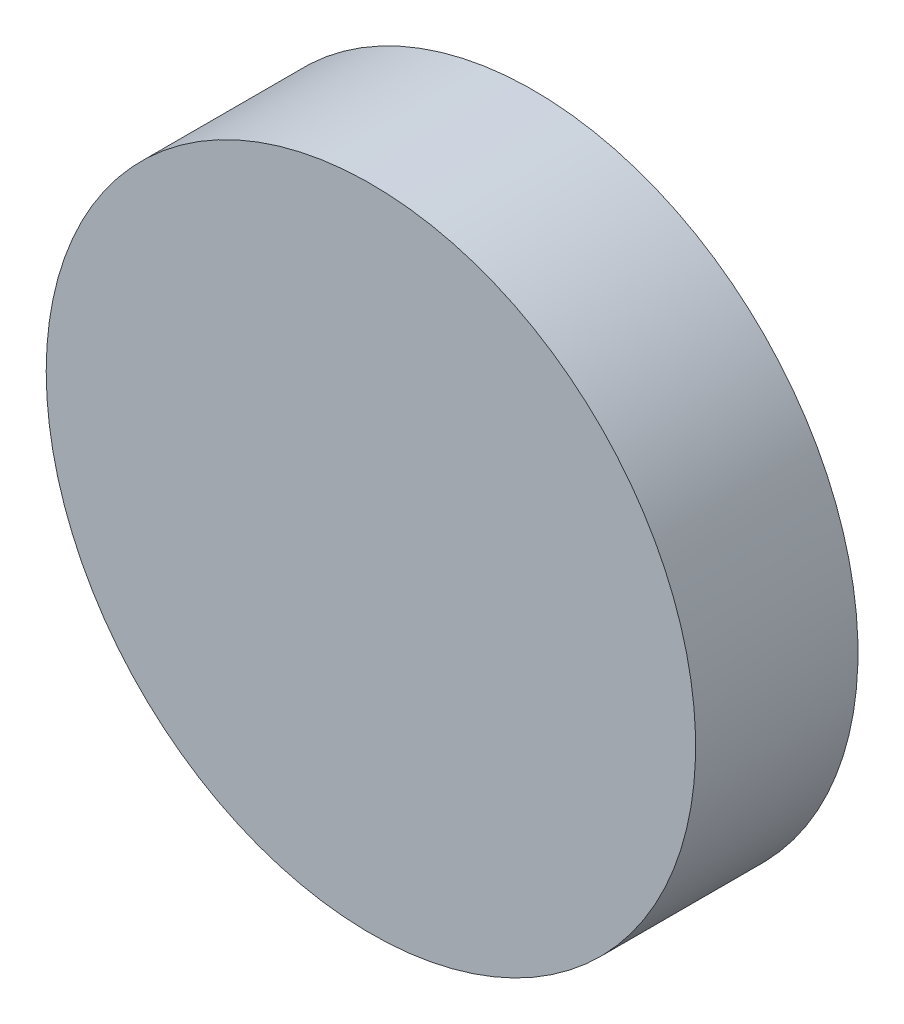
ISO-10303-21;
HEADER;
FILE_DESCRIPTION(('STEP AP214'),'2;1');
FILE_NAME('part.step','',(''),(''),'','','');
FILE_SCHEMA(('AUTOMOTIVE_DESIGN { 1 0 10303 214 1 1 1 1 }'));
ENDSEC;
DATA;
#1=APPLICATION_CONTEXT('core data for automotive mechanical design processes');
#2=APPLICATION_PROTOCOL_DEFINITION('international standard','automotive_design',2000,#1);
#3=PRODUCT_CONTEXT('',#1,'mechanical');
#4=PRODUCT('Part','Part','',(#3));
#5=PRODUCT_RELATED_PRODUCT_CATEGORY('part','',(#4));
#6=PRODUCT_DEFINITION_FORMATION('','',#4);
#7=PRODUCT_DEFINITION_CONTEXT('part definition',#1,'design');
#8=PRODUCT_DEFINITION('design','',#6,#7);
#9=PRODUCT_DEFINITION_SHAPE('','',#8);
#10=(LENGTH_UNIT() NAMED_UNIT(*) SI_UNIT(.MILLI.,.METRE.));
#11=(NAMED_UNIT(*) PLANE_ANGLE_UNIT() SI_UNIT($,.RADIAN.));
#12=(NAMED_UNIT(*) SI_UNIT($,.STERADIAN.) SOLID_ANGLE_UNIT());
#13=UNCERTAINTY_MEASURE_WITH_UNIT(LENGTH_MEASURE(1.E-05),#10,'distance_accuracy_value','');
#14=(GEOMETRIC_REPRESENTATION_CONTEXT(3) GLOBAL_UNCERTAINTY_ASSIGNED_CONTEXT((#13)) GLOBAL_UNIT_ASSIGNED_CONTEXT((#10,
#11,#12)) REPRESENTATION_CONTEXT('',''));
#15=CARTESIAN_POINT('',(0.,0.,0.));
#16=DIRECTION('',(0.,0.,1.));
#17=DIRECTION('',(1.,0.,0.));
#18=AXIS2_PLACEMENT_3D('',#15,#16,#17);
#19=CARTESIAN_POINT('',(0.,0.,-2.));
#20=DIRECTION('',(0.,0.,-1.));
#21=DIRECTION('',(-1.,0.,0.));
#22=AXIS2_PLACEMENT_3D('',#19,#20,#21);
#23=CYLINDRICAL_SURFACE('',#22,4.);
#24=CARTESIAN_POINT('',(0.,0.,0.));
#25=DIRECTION('',(0.,0.,-1.));
#26=DIRECTION('',(-1.,0.,0.));
#27=AXIS2_PLACEMENT_3D('',#24,#25,#26);
#28=CIRCLE('',#27,4.);
#29=CARTESIAN_POINT('',(-4.,0.,0.));
#30=VERTEX_POINT('',#29);
#31=EDGE_CURVE('E41',#30,#30,#28,.T.);
#32=ORIENTED_EDGE('',*,*,#31,.T.);
#33=EDGE_LOOP('',(#32));
#34=FACE_BOUND('',#33,.T.);
#35=CARTESIAN_POINT('',(0.,0.,-2.00000000000001));
#36=DIRECTION('',(0.,0.,-1.));
#37=DIRECTION('',(-1.,0.,0.));
#38=AXIS2_PLACEMENT_3D('',#35,#36,#37);
#39=CIRCLE('',#38,4.);
#40=CARTESIAN_POINT('',(-4.,0.,-2.));
#41=VERTEX_POINT('',#40);
#42=EDGE_CURVE('E10',#41,#41,#39,.T.);
#43=ORIENTED_EDGE('',*,*,#42,.F.);
#44=EDGE_LOOP('',(#43));
#45=FACE_BOUND('',#44,.T.);
#46=ADVANCED_FACE('F35',(#34,#45),#23,.T.);
#47=CARTESIAN_POINT('',(-4.,0.,-2.));
#48=DIRECTION('',(0.,0.,-1.));
#49=DIRECTION('',(-1.,0.,0.));
#50=AXIS2_PLACEMENT_3D('',#47,#48,#49);
#51=PLANE('',#50);
#52=ORIENTED_EDGE('',*,*,#42,.T.);
#53=EDGE_LOOP('',(#52));
#54=FACE_BOUND('',#53,.T.);
#55=ADVANCED_FACE('F51',(#54),#51,.T.);
#56=CARTESIAN_POINT('',(0.,0.,0.));
#57=DIRECTION('',(0.,0.,1.));
#58=DIRECTION('',(1.,0.,0.));
#59=AXIS2_PLACEMENT_3D('',#56,#57,#58);
#60=PLANE('',#59);
#61=ORIENTED_EDGE('',*,*,#31,.F.);
#62=EDGE_LOOP('',(#61));
#63=FACE_BOUND('',#62,.T.);
#64=ADVANCED_FACE('F49',(#63),#60,.T.);
#65=CLOSED_SHELL('',(#46,#55,#64));
#66=MANIFOLD_SOLID_BREP('B2',#65);
#67=ADVANCED_BREP_SHAPE_REPRESENTATION('',(#18,#66),#14);
#68=SHAPE_DEFINITION_REPRESENTATION(#9,#67);
ENDSEC;
END-ISO-10303-21;
